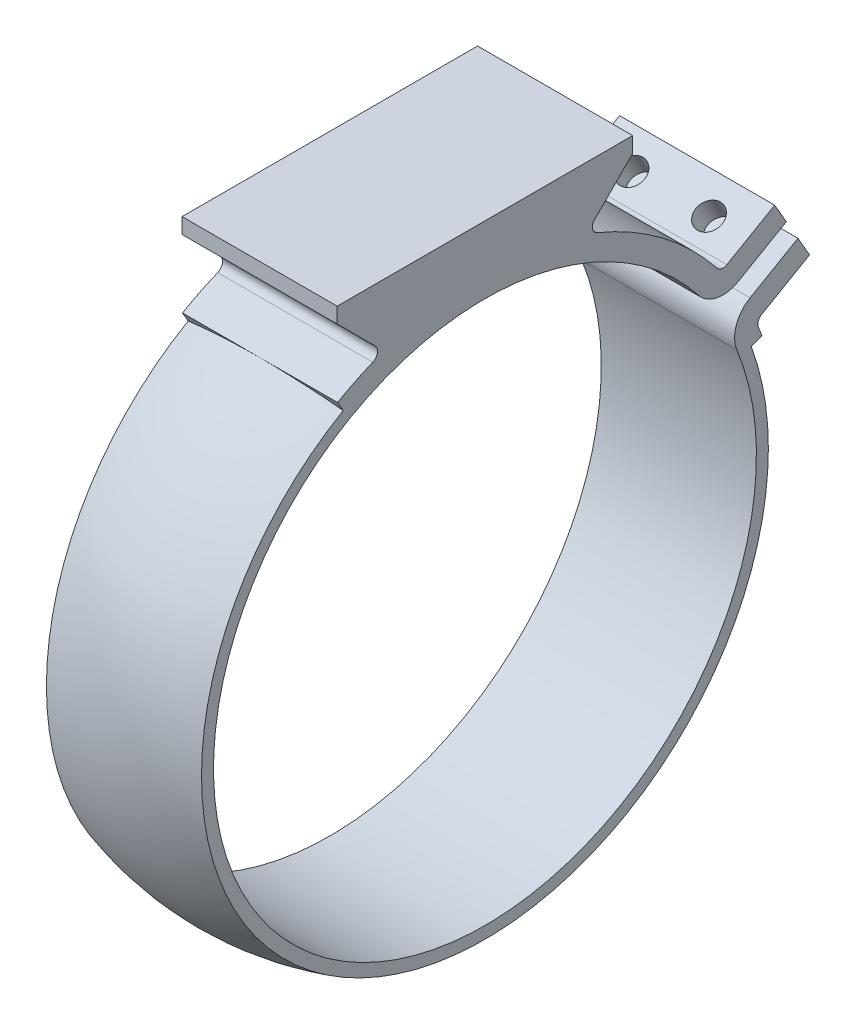
ISO-10303-21;
HEADER;
FILE_DESCRIPTION(('STEP AP214'),'2;1');
FILE_NAME('part.step','',(''),(''),'','','');
FILE_SCHEMA(('AUTOMOTIVE_DESIGN { 1 0 10303 214 1 1 1 1 }'));
ENDSEC;
DATA;
#1=APPLICATION_CONTEXT('core data for automotive mechanical design processes');
#2=APPLICATION_PROTOCOL_DEFINITION('international standard','automotive_design',2000,#1);
#3=PRODUCT_CONTEXT('',#1,'mechanical');
#4=PRODUCT('Part','Part','',(#3));
#5=PRODUCT_RELATED_PRODUCT_CATEGORY('part','',(#4));
#6=PRODUCT_DEFINITION_FORMATION('','',#4);
#7=PRODUCT_DEFINITION_CONTEXT('part definition',#1,'design');
#8=PRODUCT_DEFINITION('design','',#6,#7);
#9=PRODUCT_DEFINITION_SHAPE('','',#8);
#10=(LENGTH_UNIT() NAMED_UNIT(*) SI_UNIT(.MILLI.,.METRE.));
#11=(NAMED_UNIT(*) PLANE_ANGLE_UNIT() SI_UNIT($,.RADIAN.));
#12=(NAMED_UNIT(*) SI_UNIT($,.STERADIAN.) SOLID_ANGLE_UNIT());
#13=UNCERTAINTY_MEASURE_WITH_UNIT(LENGTH_MEASURE(1.E-05),#10,'distance_accuracy_value','');
#14=(GEOMETRIC_REPRESENTATION_CONTEXT(3) GLOBAL_UNCERTAINTY_ASSIGNED_CONTEXT((#13)) GLOBAL_UNIT_ASSIGNED_CONTEXT((#10,
#11,#12)) REPRESENTATION_CONTEXT('',''));
#15=CARTESIAN_POINT('',(0.,0.,0.));
#16=DIRECTION('',(0.,0.,1.));
#17=DIRECTION('',(1.,0.,0.));
#18=AXIS2_PLACEMENT_3D('',#15,#16,#17);
#19=CARTESIAN_POINT('',(20.,0.,0.));
#20=DIRECTION('',(-1.,0.,0.));
#21=DIRECTION('',(0.,0.,1.));
#22=AXIS2_PLACEMENT_3D('',#19,#20,#21);
#23=CYLINDRICAL_SURFACE('',#22,38.0000000000001);
#24=DIRECTION('',(-1.,0.,0.));
#25=VECTOR('',#24,1.);
#26=CARTESIAN_POINT('',(20.,12.9967654463756,-35.7083195898645));
#27=LINE('',#26,#25);
#28=CARTESIAN_POINT('',(0.,12.9967654463756,-35.7083195898645));
#29=VERTEX_POINT('',#28);
#30=CARTESIAN_POINT('',(10.,12.9967654463756,-35.7083195898645));
#31=VERTEX_POINT('',#30);
#32=EDGE_CURVE('E238',#29,#31,#27,.F.);
#33=ORIENTED_EDGE('',*,*,#32,.F.);
#34=CARTESIAN_POINT('',(0.,0.,0.));
#35=DIRECTION('',(1.,0.,0.));
#36=DIRECTION('',(0.,0.,-1.));
#37=AXIS2_PLACEMENT_3D('',#34,#35,#36);
#38=CIRCLE('',#37,38.0000000000001);
#39=CARTESIAN_POINT('',(0.,14.1691049973129,-35.2595584710746));
#40=VERTEX_POINT('',#39);
#41=EDGE_CURVE('E271',#29,#40,#38,.T.);
#42=ORIENTED_EDGE('',*,*,#41,.T.);
#43=DIRECTION('',(-1.,0.,0.));
#44=VECTOR('',#43,1.);
#45=CARTESIAN_POINT('',(20.,14.1691049973129,-35.2595584710746));
#46=LINE('',#45,#44);
#47=CARTESIAN_POINT('',(20.,14.1691049973129,-35.2595584710746));
#48=VERTEX_POINT('',#47);
#49=EDGE_CURVE('E373',#40,#48,#46,.F.);
#50=ORIENTED_EDGE('',*,*,#49,.T.);
#51=CARTESIAN_POINT('',(20.,0.,0.));
#52=DIRECTION('',(1.,0.,0.));
#53=DIRECTION('',(0.,0.,-1.));
#54=AXIS2_PLACEMENT_3D('',#51,#52,#53);
#55=CIRCLE('',#54,38.0000000000001);
#56=CARTESIAN_POINT('',(20.,12.9967654463756,-35.7083195898645));
#57=VERTEX_POINT('',#56);
#58=EDGE_CURVE('E274',#57,#48,#55,.T.);
#59=ORIENTED_EDGE('',*,*,#58,.F.);
#60=EDGE_CURVE('E240',#31,#57,#27,.F.);
#61=ORIENTED_EDGE('',*,*,#60,.F.);
#62=EDGE_LOOP('',(#33,#42,#50,#59,#61));
#63=FACE_BOUND('',#62,.T.);
#64=ADVANCED_FACE('F32',(#63),#23,.T.);
#65=CARTESIAN_POINT('',(20.,0.,0.));
#66=DIRECTION('',(1.,0.,0.));
#67=DIRECTION('',(0.,0.,-1.));
#68=AXIS2_PLACEMENT_3D('',#65,#66,#67);
#69=PLANE('',#68);
#70=CARTESIAN_POINT('',(20.,0.,0.));
#71=DIRECTION('',(1.,0.,0.));
#72=DIRECTION('',(0.,0.,-1.));
#73=AXIS2_PLACEMENT_3D('',#70,#71,#72);
#74=CIRCLE('',#73,36.5410196624969);
#75=CARTESIAN_POINT('',(20.,12.4977647822334,-34.3373265328411));
#76=VERTEX_POINT('',#75);
#77=CARTESIAN_POINT('',(20.,31.6454513079091,18.2705098312483));
#78=VERTEX_POINT('',#77);
#79=EDGE_CURVE('E212',#76,#78,#74,.F.);
#80=ORIENTED_EDGE('',*,*,#79,.F.);
#81=DIRECTION('',(0.,0.342020143325672,-0.939692620785907));
#82=VECTOR('',#81,1.);
#83=CARTESIAN_POINT('',(20.,0.,0.));
#84=LINE('',#83,#82);
#85=EDGE_CURVE('E224',#76,#57,#84,.T.);
#86=ORIENTED_EDGE('',*,*,#85,.T.);
#87=ORIENTED_EDGE('',*,*,#58,.T.);
#88=CARTESIAN_POINT('',(20.,14.5419761814527,-36.1874415887344));
#89=DIRECTION('',(1.,0.,0.));
#90=DIRECTION('',(0.,0.,-1.));
#91=AXIS2_PLACEMENT_3D('',#88,#89,#90);
#92=CIRCLE('',#91,1.);
#93=CARTESIAN_POINT('',(20.,15.4080015852372,-35.6874415887344));
#94=VERTEX_POINT('',#93);
#95=EDGE_CURVE('E391',#48,#94,#92,.F.);
#96=ORIENTED_EDGE('',*,*,#95,.T.);
#97=DIRECTION('',(0.,0.499999999999998,-0.86602540378444));
#98=VECTOR('',#97,1.);
#99=CARTESIAN_POINT('',(20.,18.9691916276951,-41.85560367768));
#100=LINE('',#99,#98);
#101=CARTESIAN_POINT('',(20.,18.9691916276951,-41.85560367768));
#102=VERTEX_POINT('',#101);
#103=EDGE_CURVE('E273',#94,#102,#100,.T.);
#104=ORIENTED_EDGE('',*,*,#103,.T.);
#105=DIRECTION('',(0.,0.866025403784441,0.499999999999997));
#106=VECTOR('',#105,1.);
#107=CARTESIAN_POINT('',(20.,21.5672678390484,-40.35560367768));
#108=LINE('',#107,#106);
#109=CARTESIAN_POINT('',(20.,21.5672678390484,-40.35560367768));
#110=VERTEX_POINT('',#109);
#111=EDGE_CURVE('E276',#102,#110,#108,.T.);
#112=ORIENTED_EDGE('',*,*,#111,.T.);
#113=DIRECTION('',(0.,-0.499999999999998,0.86602540378444));
#114=VECTOR('',#113,1.);
#115=CARTESIAN_POINT('',(20.,16.1848830792284,-31.0330398077872));
#116=LINE('',#115,#114);
#117=CARTESIAN_POINT('',(20.,18.0060777965905,-34.1874415887344));
#118=VERTEX_POINT('',#117);
#119=EDGE_CURVE('E278',#110,#118,#116,.T.);
#120=ORIENTED_EDGE('',*,*,#119,.T.);
#121=CARTESIAN_POINT('',(20.,14.5419761814527,-36.1874415887344));
#122=DIRECTION('',(1.,0.,0.));
#123=DIRECTION('',(0.,0.,-1.));
#124=AXIS2_PLACEMENT_3D('',#121,#122,#123);
#125=CIRCLE('',#124,4.);
#126=CARTESIAN_POINT('',(20.,13.0504914448935,-32.475909118095));
#127=VERTEX_POINT('',#126);
#128=EDGE_CURVE('E418',#118,#127,#125,.T.);
#129=ORIENTED_EDGE('',*,*,#128,.T.);
#130=CARTESIAN_POINT('',(20.,0.,0.));
#131=DIRECTION('',(-1.,0.,0.));
#132=DIRECTION('',(0.,0.,-1.));
#133=AXIS2_PLACEMENT_3D('',#130,#131,#132);
#134=CIRCLE('',#133,35.);
#135=CARTESIAN_POINT('',(20.,21.5997165848169,-27.5400116821977));
#136=VERTEX_POINT('',#135);
#137=EDGE_CURVE('E281',#127,#136,#134,.T.);
#138=ORIENTED_EDGE('',*,*,#137,.T.);
#139=CARTESIAN_POINT('',(20.,24.0682556230817,-30.6874415887346));
#140=DIRECTION('',(1.,0.,0.));
#141=DIRECTION('',(0.,0.,-1.));
#142=AXIS2_PLACEMENT_3D('',#139,#140,#141);
#143=CIRCLE('',#142,4.);
#144=CARTESIAN_POINT('',(20.,20.6041540079439,-32.6874415887346));
#145=VERTEX_POINT('',#144);
#146=EDGE_CURVE('E416',#136,#145,#143,.T.);
#147=ORIENTED_EDGE('',*,*,#146,.T.);
#148=DIRECTION('',(0.,0.499999999999998,-0.86602540378444));
#149=VECTOR('',#148,1.);
#150=CARTESIAN_POINT('',(20.,18.7829592905818,-29.5330398077873));
#151=LINE('',#150,#149);
#152=CARTESIAN_POINT('',(20.,24.1653440504018,-38.85560367768));
#153=VERTEX_POINT('',#152);
#154=EDGE_CURVE('E284',#145,#153,#151,.T.);
#155=ORIENTED_EDGE('',*,*,#154,.T.);
#156=DIRECTION('',(0.,0.866025403784441,0.499999999999997));
#157=VECTOR('',#156,1.);
#158=CARTESIAN_POINT('',(20.,24.1653440504018,-38.85560367768));
#159=LINE('',#158,#157);
#160=CARTESIAN_POINT('',(20.,26.7634202617551,-37.35560367768));
#161=VERTEX_POINT('',#160);
#162=EDGE_CURVE('E286',#153,#161,#159,.T.);
#163=ORIENTED_EDGE('',*,*,#162,.T.);
#164=DIRECTION('',(0.,-0.499999999999997,0.86602540378444));
#165=VECTOR('',#164,1.);
#166=CARTESIAN_POINT('',(20.,26.7634202617551,-37.35560367768));
#167=LINE('',#166,#165);
#168=CARTESIAN_POINT('',(20.,23.2022302192972,-31.1874415887346));
#169=VERTEX_POINT('',#168);
#170=EDGE_CURVE('E288',#161,#169,#167,.T.);
#171=ORIENTED_EDGE('',*,*,#170,.T.);
#172=CARTESIAN_POINT('',(20.,24.0682556230816,-30.6874415887346));
#173=DIRECTION('',(1.,0.,0.));
#174=DIRECTION('',(0.,0.,-1.));
#175=AXIS2_PLACEMENT_3D('',#172,#173,#174);
#176=CIRCLE('',#175,1.);
#177=CARTESIAN_POINT('',(20.,23.4511208635154,-29.9005841121003));
#178=VERTEX_POINT('',#177);
#179=EDGE_CURVE('E395',#169,#178,#176,.F.);
#180=ORIENTED_EDGE('',*,*,#179,.T.);
#181=CARTESIAN_POINT('',(20.,0.,0.));
#182=DIRECTION('',(1.,0.,0.));
#183=DIRECTION('',(0.,0.,-1.));
#184=AXIS2_PLACEMENT_3D('',#181,#182,#183);
#185=CIRCLE('',#184,38.);
#186=CARTESIAN_POINT('',(20.,35.1410300021787,-14.4605674295988));
#187=VERTEX_POINT('',#186);
#188=EDGE_CURVE('E291',#178,#187,#185,.T.);
#189=ORIENTED_EDGE('',*,*,#188,.T.);
#190=CARTESIAN_POINT('',(20.,36.0657939496044,-14.8411086777461));
#191=DIRECTION('',(1.,0.,0.));
#192=DIRECTION('',(0.,0.,-1.));
#193=AXIS2_PLACEMENT_3D('',#190,#191,#192);
#194=CIRCLE('',#193,1.);
#195=CARTESIAN_POINT('',(20.,36.772900730791,-14.1340018965596));
#196=VERTEX_POINT('',#195);
#197=EDGE_CURVE('E403',#187,#196,#194,.F.);
#198=ORIENTED_EDGE('',*,*,#197,.T.);
#199=DIRECTION('',(0.,0.707106781186544,-0.707106781186551));
#200=VECTOR('',#199,1.);
#201=CARTESIAN_POINT('',(20.,41.6888988342313,-19.05));
#202=LINE('',#201,#200);
#203=CARTESIAN_POINT('',(20.,41.6888988342313,-19.05));
#204=VERTEX_POINT('',#203);
#205=EDGE_CURVE('E294',#196,#204,#202,.T.);
#206=ORIENTED_EDGE('',*,*,#205,.T.);
#207=DIRECTION('',(0.,1.,0.));
#208=VECTOR('',#207,1.);
#209=CARTESIAN_POINT('',(20.,43.6888988342313,-19.05));
#210=LINE('',#209,#208);
#211=CARTESIAN_POINT('',(20.,43.6888988342313,-19.05));
#212=VERTEX_POINT('',#211);
#213=EDGE_CURVE('E296',#204,#212,#210,.T.);
#214=ORIENTED_EDGE('',*,*,#213,.T.);
#215=DIRECTION('',(0.,0.,1.));
#216=VECTOR('',#215,1.);
#217=CARTESIAN_POINT('',(20.,43.6888988342313,19.05));
#218=LINE('',#217,#216);
#219=CARTESIAN_POINT('',(20.,43.6888988342313,19.05));
#220=VERTEX_POINT('',#219);
#221=EDGE_CURVE('E298',#212,#220,#218,.T.);
#222=ORIENTED_EDGE('',*,*,#221,.T.);
#223=DIRECTION('',(0.,-1.,0.));
#224=VECTOR('',#223,1.);
#225=CARTESIAN_POINT('',(20.,41.6888988342313,19.05));
#226=LINE('',#225,#224);
#227=CARTESIAN_POINT('',(20.,41.6888988342313,19.05));
#228=VERTEX_POINT('',#227);
#229=EDGE_CURVE('E300',#220,#228,#226,.T.);
#230=ORIENTED_EDGE('',*,*,#229,.T.);
#231=DIRECTION('',(0.,-0.707106781186549,-0.707106781186546));
#232=VECTOR('',#231,1.);
#233=CARTESIAN_POINT('',(20.,35.6888988342313,13.05));
#234=LINE('',#233,#232);
#235=CARTESIAN_POINT('',(20.,36.7729007307911,14.1340018965597));
#236=VERTEX_POINT('',#235);
#237=EDGE_CURVE('E302',#228,#236,#234,.T.);
#238=ORIENTED_EDGE('',*,*,#237,.T.);
#239=CARTESIAN_POINT('',(20.,36.0657939496045,14.8411086777463));
#240=DIRECTION('',(1.,0.,0.));
#241=DIRECTION('',(0.,0.,-1.));
#242=AXIS2_PLACEMENT_3D('',#239,#240,#241);
#243=CIRCLE('',#242,1.);
#244=CARTESIAN_POINT('',(20.,35.1410300021787,14.4605674295989));
#245=VERTEX_POINT('',#244);
#246=EDGE_CURVE('E399',#236,#245,#243,.F.);
#247=ORIENTED_EDGE('',*,*,#246,.T.);
#248=CARTESIAN_POINT('',(20.,32.9089653438088,18.9999999999998));
#249=VERTEX_POINT('',#248);
#250=EDGE_CURVE('E237',#245,#249,#55,.T.);
#251=ORIENTED_EDGE('',*,*,#250,.T.);
#252=DIRECTION('',(0.,0.866025403784442,0.499999999999995));
#253=VECTOR('',#252,1.);
#254=CARTESIAN_POINT('',(20.,0.,0.));
#255=LINE('',#254,#253);
#256=EDGE_CURVE('E228',#78,#249,#255,.T.);
#257=ORIENTED_EDGE('',*,*,#256,.F.);
#258=EDGE_LOOP('',(#80,#86,#87,#96,#104,#112,#120,#129,#138,#147,#155,#163,#171,#180,#189,#198,
#206,#214,#222,#230,#238,#247,#251,#257));
#259=FACE_BOUND('',#258,.T.);
#260=ADVANCED_FACE('F235',(#259),#69,.T.);
#261=CARTESIAN_POINT('',(0.,0.,0.));
#262=DIRECTION('',(1.,0.,0.));
#263=DIRECTION('',(0.,0.,-1.));
#264=AXIS2_PLACEMENT_3D('',#261,#262,#263);
#265=PLANE('',#264);
#266=DIRECTION('',(0.,0.342020143325672,-0.939692620785907));
#267=VECTOR('',#266,1.);
#268=CARTESIAN_POINT('',(0.,0.,0.));
#269=LINE('',#268,#267);
#270=CARTESIAN_POINT('',(0.,12.4977647822334,-34.3373265328411));
#271=VERTEX_POINT('',#270);
#272=EDGE_CURVE('E11',#271,#29,#269,.T.);
#273=ORIENTED_EDGE('',*,*,#272,.F.);
#274=CARTESIAN_POINT('',(0.,0.,0.));
#275=DIRECTION('',(1.,0.,0.));
#276=DIRECTION('',(0.,0.,-1.));
#277=AXIS2_PLACEMENT_3D('',#274,#275,#276);
#278=CIRCLE('',#277,36.5410196624969);
#279=CARTESIAN_POINT('',(0.,31.6454513079091,18.2705098312483));
#280=VERTEX_POINT('',#279);
#281=EDGE_CURVE('E40',#271,#280,#278,.F.);
#282=ORIENTED_EDGE('',*,*,#281,.T.);
#283=DIRECTION('',(0.,0.866025403784442,0.499999999999995));
#284=VECTOR('',#283,1.);
#285=CARTESIAN_POINT('',(0.,0.,0.));
#286=LINE('',#285,#284);
#287=CARTESIAN_POINT('',(0.,32.9089653438088,18.9999999999998));
#288=VERTEX_POINT('',#287);
#289=EDGE_CURVE('E423',#280,#288,#286,.T.);
#290=ORIENTED_EDGE('',*,*,#289,.T.);
#291=CARTESIAN_POINT('',(0.,35.1410300021787,14.4605674295989));
#292=VERTEX_POINT('',#291);
#293=EDGE_CURVE('E306',#292,#288,#38,.T.);
#294=ORIENTED_EDGE('',*,*,#293,.F.);
#295=CARTESIAN_POINT('',(0.,36.0657939496045,14.8411086777463));
#296=DIRECTION('',(1.,0.,0.));
#297=DIRECTION('',(0.,0.,-1.));
#298=AXIS2_PLACEMENT_3D('',#295,#296,#297);
#299=CIRCLE('',#298,1.);
#300=CARTESIAN_POINT('',(0.,36.7729007307911,14.1340018965597));
#301=VERTEX_POINT('',#300);
#302=EDGE_CURVE('E397',#292,#301,#299,.T.);
#303=ORIENTED_EDGE('',*,*,#302,.T.);
#304=DIRECTION('',(0.,-0.707106781186549,-0.707106781186546));
#305=VECTOR('',#304,1.);
#306=CARTESIAN_POINT('',(0.,35.6888988342313,13.05));
#307=LINE('',#306,#305);
#308=CARTESIAN_POINT('',(0.,41.6888988342313,19.05));
#309=VERTEX_POINT('',#308);
#310=EDGE_CURVE('E337',#309,#301,#307,.T.);
#311=ORIENTED_EDGE('',*,*,#310,.F.);
#312=DIRECTION('',(0.,-1.,0.));
#313=VECTOR('',#312,1.);
#314=CARTESIAN_POINT('',(0.,41.6888988342313,19.05));
#315=LINE('',#314,#313);
#316=CARTESIAN_POINT('',(0.,43.6888988342313,19.05));
#317=VERTEX_POINT('',#316);
#318=EDGE_CURVE('E335',#317,#309,#315,.T.);
#319=ORIENTED_EDGE('',*,*,#318,.F.);
#320=DIRECTION('',(0.,0.,1.));
#321=VECTOR('',#320,1.);
#322=CARTESIAN_POINT('',(0.,43.6888988342313,19.05));
#323=LINE('',#322,#321);
#324=CARTESIAN_POINT('',(0.,43.6888988342313,-19.05));
#325=VERTEX_POINT('',#324);
#326=EDGE_CURVE('E333',#325,#317,#323,.T.);
#327=ORIENTED_EDGE('',*,*,#326,.F.);
#328=DIRECTION('',(0.,1.,0.));
#329=VECTOR('',#328,1.);
#330=CARTESIAN_POINT('',(0.,43.6888988342313,-19.05));
#331=LINE('',#330,#329);
#332=CARTESIAN_POINT('',(0.,41.6888988342313,-19.05));
#333=VERTEX_POINT('',#332);
#334=EDGE_CURVE('E331',#333,#325,#331,.T.);
#335=ORIENTED_EDGE('',*,*,#334,.F.);
#336=DIRECTION('',(0.,0.707106781186544,-0.707106781186551));
#337=VECTOR('',#336,1.);
#338=CARTESIAN_POINT('',(0.,41.6888988342313,-19.05));
#339=LINE('',#338,#337);
#340=CARTESIAN_POINT('',(0.,36.772900730791,-14.1340018965596));
#341=VERTEX_POINT('',#340);
#342=EDGE_CURVE('E329',#341,#333,#339,.T.);
#343=ORIENTED_EDGE('',*,*,#342,.F.);
#344=CARTESIAN_POINT('',(0.,36.0657939496044,-14.8411086777461));
#345=DIRECTION('',(1.,0.,0.));
#346=DIRECTION('',(0.,0.,-1.));
#347=AXIS2_PLACEMENT_3D('',#344,#345,#346);
#348=CIRCLE('',#347,1.);
#349=CARTESIAN_POINT('',(0.,35.1410300021787,-14.4605674295988));
#350=VERTEX_POINT('',#349);
#351=EDGE_CURVE('E401',#341,#350,#348,.T.);
#352=ORIENTED_EDGE('',*,*,#351,.T.);
#353=CARTESIAN_POINT('',(0.,0.,0.));
#354=DIRECTION('',(1.,0.,0.));
#355=DIRECTION('',(0.,0.,-1.));
#356=AXIS2_PLACEMENT_3D('',#353,#354,#355);
#357=CIRCLE('',#356,38.);
#358=CARTESIAN_POINT('',(0.,23.4511208635154,-29.9005841121003));
#359=VERTEX_POINT('',#358);
#360=EDGE_CURVE('E326',#359,#350,#357,.T.);
#361=ORIENTED_EDGE('',*,*,#360,.F.);
#362=CARTESIAN_POINT('',(0.,24.0682556230816,-30.6874415887346));
#363=DIRECTION('',(1.,0.,0.));
#364=DIRECTION('',(0.,0.,-1.));
#365=AXIS2_PLACEMENT_3D('',#362,#363,#364);
#366=CIRCLE('',#365,1.);
#367=CARTESIAN_POINT('',(0.,23.2022302192972,-31.1874415887346));
#368=VERTEX_POINT('',#367);
#369=EDGE_CURVE('E393',#359,#368,#366,.T.);
#370=ORIENTED_EDGE('',*,*,#369,.T.);
#371=DIRECTION('',(0.,-0.499999999999997,0.86602540378444));
#372=VECTOR('',#371,1.);
#373=CARTESIAN_POINT('',(0.,26.7634202617551,-37.35560367768));
#374=LINE('',#373,#372);
#375=CARTESIAN_POINT('',(0.,26.7634202617551,-37.35560367768));
#376=VERTEX_POINT('',#375);
#377=EDGE_CURVE('E323',#376,#368,#374,.T.);
#378=ORIENTED_EDGE('',*,*,#377,.F.);
#379=DIRECTION('',(0.,0.866025403784441,0.499999999999997));
#380=VECTOR('',#379,1.);
#381=CARTESIAN_POINT('',(0.,24.1653440504018,-38.85560367768));
#382=LINE('',#381,#380);
#383=CARTESIAN_POINT('',(0.,24.1653440504018,-38.85560367768));
#384=VERTEX_POINT('',#383);
#385=EDGE_CURVE('E321',#384,#376,#382,.T.);
#386=ORIENTED_EDGE('',*,*,#385,.F.);
#387=DIRECTION('',(0.,0.499999999999998,-0.86602540378444));
#388=VECTOR('',#387,1.);
#389=CARTESIAN_POINT('',(0.,18.7829592905818,-29.5330398077873));
#390=LINE('',#389,#388);
#391=CARTESIAN_POINT('',(0.,20.6041540079439,-32.6874415887346));
#392=VERTEX_POINT('',#391);
#393=EDGE_CURVE('E319',#392,#384,#390,.T.);
#394=ORIENTED_EDGE('',*,*,#393,.F.);
#395=CARTESIAN_POINT('',(0.,24.0682556230817,-30.6874415887346));
#396=DIRECTION('',(1.,0.,0.));
#397=DIRECTION('',(0.,0.,-1.));
#398=AXIS2_PLACEMENT_3D('',#395,#396,#397);
#399=CIRCLE('',#398,4.);
#400=CARTESIAN_POINT('',(0.,21.5997165848169,-27.5400116821977));
#401=VERTEX_POINT('',#400);
#402=EDGE_CURVE('E410',#392,#401,#399,.F.);
#403=ORIENTED_EDGE('',*,*,#402,.T.);
#404=CARTESIAN_POINT('',(0.,0.,0.));
#405=DIRECTION('',(-1.,0.,0.));
#406=DIRECTION('',(0.,0.,-1.));
#407=AXIS2_PLACEMENT_3D('',#404,#405,#406);
#408=CIRCLE('',#407,35.);
#409=CARTESIAN_POINT('',(0.,13.0504914448935,-32.475909118095));
#410=VERTEX_POINT('',#409);
#411=EDGE_CURVE('E316',#410,#401,#408,.T.);
#412=ORIENTED_EDGE('',*,*,#411,.F.);
#413=CARTESIAN_POINT('',(0.,14.5419761814527,-36.1874415887344));
#414=DIRECTION('',(1.,0.,0.));
#415=DIRECTION('',(0.,0.,-1.));
#416=AXIS2_PLACEMENT_3D('',#413,#414,#415);
#417=CIRCLE('',#416,4.);
#418=CARTESIAN_POINT('',(0.,18.0060777965905,-34.1874415887344));
#419=VERTEX_POINT('',#418);
#420=EDGE_CURVE('E412',#410,#419,#417,.F.);
#421=ORIENTED_EDGE('',*,*,#420,.T.);
#422=DIRECTION('',(0.,-0.499999999999998,0.86602540378444));
#423=VECTOR('',#422,1.);
#424=CARTESIAN_POINT('',(0.,16.1848830792284,-31.0330398077872));
#425=LINE('',#424,#423);
#426=CARTESIAN_POINT('',(0.,21.5672678390484,-40.35560367768));
#427=VERTEX_POINT('',#426);
#428=EDGE_CURVE('E313',#427,#419,#425,.T.);
#429=ORIENTED_EDGE('',*,*,#428,.F.);
#430=DIRECTION('',(0.,0.866025403784441,0.499999999999997));
#431=VECTOR('',#430,1.);
#432=CARTESIAN_POINT('',(0.,21.5672678390484,-40.35560367768));
#433=LINE('',#432,#431);
#434=CARTESIAN_POINT('',(0.,18.9691916276951,-41.85560367768));
#435=VERTEX_POINT('',#434);
#436=EDGE_CURVE('E311',#435,#427,#433,.T.);
#437=ORIENTED_EDGE('',*,*,#436,.F.);
#438=DIRECTION('',(0.,0.499999999999998,-0.86602540378444));
#439=VECTOR('',#438,1.);
#440=CARTESIAN_POINT('',(0.,18.9691916276951,-41.85560367768));
#441=LINE('',#440,#439);
#442=CARTESIAN_POINT('',(0.,15.4080015852372,-35.6874415887344));
#443=VERTEX_POINT('',#442);
#444=EDGE_CURVE('E309',#443,#435,#441,.T.);
#445=ORIENTED_EDGE('',*,*,#444,.F.);
#446=CARTESIAN_POINT('',(0.,14.5419761814527,-36.1874415887344));
#447=DIRECTION('',(1.,0.,0.));
#448=DIRECTION('',(0.,0.,-1.));
#449=AXIS2_PLACEMENT_3D('',#446,#447,#448);
#450=CIRCLE('',#449,1.);
#451=EDGE_CURVE('E388',#443,#40,#450,.T.);
#452=ORIENTED_EDGE('',*,*,#451,.T.);
#453=ORIENTED_EDGE('',*,*,#41,.F.);
#454=EDGE_LOOP('',(#273,#282,#290,#294,#303,#311,#319,#327,#335,#343,#352,#361,#370,#378,#386,
#394,#403,#412,#421,#429,#437,#445,#452,#453));
#455=FACE_BOUND('',#454,.T.);
#456=ADVANCED_FACE('F431',(#455),#265,.F.);
#457=ORIENTED_EDGE('',*,*,#293,.T.);
#458=DIRECTION('',(-1.,0.,0.));
#459=VECTOR('',#458,1.);
#460=CARTESIAN_POINT('',(20.,32.9089653438088,18.9999999999998));
#461=LINE('',#460,#459);
#462=CARTESIAN_POINT('',(10.,32.9089653438088,18.9999999999998));
#463=VERTEX_POINT('',#462);
#464=EDGE_CURVE('E47',#288,#463,#461,.F.);
#465=ORIENTED_EDGE('',*,*,#464,.T.);
#466=EDGE_CURVE('E230',#463,#249,#461,.F.);
#467=ORIENTED_EDGE('',*,*,#466,.T.);
#468=ORIENTED_EDGE('',*,*,#250,.F.);
#469=DIRECTION('',(-1.,0.,0.));
#470=VECTOR('',#469,1.);
#471=CARTESIAN_POINT('',(20.,35.1410300021787,14.4605674295989));
#472=LINE('',#471,#470);
#473=EDGE_CURVE('E367',#245,#292,#472,.T.);
#474=ORIENTED_EDGE('',*,*,#473,.T.);
#475=EDGE_LOOP('',(#457,#465,#467,#468,#474));
#476=FACE_BOUND('',#475,.T.);
#477=ADVANCED_FACE('F441',(#476),#23,.T.);
#478=CARTESIAN_POINT('',(20.,18.9691916276951,-41.85560367768));
#479=DIRECTION('',(0.,0.86602540378444,0.499999999999998));
#480=DIRECTION('',(0.,-0.499999999999998,0.86602540378444));
#481=AXIS2_PLACEMENT_3D('',#478,#479,#480);
#482=PLANE('',#481);
#483=DIRECTION('',(1.,0.,0.));
#484=VECTOR('',#483,1.);
#485=CARTESIAN_POINT('',(0.,15.4080015852372,-35.6874415887344));
#486=LINE('',#485,#484);
#487=CARTESIAN_POINT('',(15.4162242248121,15.4080015852372,-35.6874415887344));
#488=VERTEX_POINT('',#487);
#489=EDGE_CURVE('E364',#94,#488,#486,.F.);
#490=ORIENTED_EDGE('',*,*,#489,.T.);
#491=CARTESIAN_POINT('',(15.,16.9691916276951,-38.3915020625422));
#492=DIRECTION('',(0.,-0.86602540378444,-0.499999999999998));
#493=DIRECTION('',(0.,0.499999999999998,-0.86602540378444));
#494=AXIS2_PLACEMENT_3D('',#491,#492,#493);
#495=CIRCLE('',#494,3.15);
#496=CARTESIAN_POINT('',(14.5837757751879,15.4080015852372,-35.6874415887344));
#497=VERTEX_POINT('',#496);
#498=EDGE_CURVE('E223',#497,#488,#495,.T.);
#499=ORIENTED_EDGE('',*,*,#498,.F.);
#500=CARTESIAN_POINT('',(5.41622422481207,15.4080015852372,-35.6874415887344));
#501=VERTEX_POINT('',#500);
#502=EDGE_CURVE('E369',#497,#501,#486,.F.);
#503=ORIENTED_EDGE('',*,*,#502,.T.);
#504=CARTESIAN_POINT('',(5.,16.9691916276951,-38.3915020625422));
#505=DIRECTION('',(0.,-0.86602540378444,-0.499999999999998));
#506=DIRECTION('',(0.,0.499999999999998,-0.86602540378444));
#507=AXIS2_PLACEMENT_3D('',#504,#505,#506);
#508=CIRCLE('',#507,3.15);
#509=CARTESIAN_POINT('',(4.58377577518786,15.4080015852372,-35.6874415887344));
#510=VERTEX_POINT('',#509);
#511=EDGE_CURVE('E257',#510,#501,#508,.T.);
#512=ORIENTED_EDGE('',*,*,#511,.F.);
#513=EDGE_CURVE('E363',#510,#443,#486,.F.);
#514=ORIENTED_EDGE('',*,*,#513,.T.);
#515=ORIENTED_EDGE('',*,*,#444,.T.);
#516=DIRECTION('',(-1.,0.,0.));
#517=VECTOR('',#516,1.);
#518=CARTESIAN_POINT('',(20.,18.9691916276951,-41.85560367768));
#519=LINE('',#518,#517);
#520=EDGE_CURVE('E360',#102,#435,#519,.T.);
#521=ORIENTED_EDGE('',*,*,#520,.F.);
#522=ORIENTED_EDGE('',*,*,#103,.F.);
#523=EDGE_LOOP('',(#490,#499,#503,#512,#514,#515,#521,#522));
#524=FACE_BOUND('',#523,.T.);
#525=ADVANCED_FACE('F526',(#524),#482,.F.);
#526=CARTESIAN_POINT('',(20.,21.5672678390484,-40.35560367768));
#527=DIRECTION('',(0.,-0.499999999999997,0.866025403784441));
#528=DIRECTION('',(0.,-0.866025403784441,-0.499999999999997));
#529=AXIS2_PLACEMENT_3D('',#526,#527,#528);
#530=PLANE('',#529);
#531=ORIENTED_EDGE('',*,*,#436,.T.);
#532=DIRECTION('',(-1.,0.,0.));
#533=VECTOR('',#532,1.);
#534=CARTESIAN_POINT('',(20.,21.5672678390484,-40.35560367768));
#535=LINE('',#534,#533);
#536=EDGE_CURVE('E357',#110,#427,#535,.T.);
#537=ORIENTED_EDGE('',*,*,#536,.F.);
#538=ORIENTED_EDGE('',*,*,#111,.F.);
#539=ORIENTED_EDGE('',*,*,#520,.T.);
#540=EDGE_LOOP('',(#531,#537,#538,#539));
#541=FACE_BOUND('',#540,.T.);
#542=ADVANCED_FACE('F520',(#541),#530,.F.);
#543=CARTESIAN_POINT('',(20.,16.1848830792284,-31.0330398077872));
#544=DIRECTION('',(0.,-0.86602540378444,-0.499999999999998));
#545=DIRECTION('',(0.,0.499999999999998,-0.86602540378444));
#546=AXIS2_PLACEMENT_3D('',#543,#544,#545);
#547=PLANE('',#546);
#548=CARTESIAN_POINT('',(15.,19.5672678390484,-36.8915020625422));
#549=DIRECTION('',(0.,-0.86602540378444,-0.499999999999998));
#550=DIRECTION('',(0.,0.499999999999998,-0.86602540378444));
#551=AXIS2_PLACEMENT_3D('',#548,#549,#550);
#552=CIRCLE('',#551,1.69999999999999);
#553=CARTESIAN_POINT('',(15.,20.4172678390484,-38.3637452489758));
#554=VERTEX_POINT('',#553);
#555=EDGE_CURVE('E254',#554,#554,#552,.T.);
#556=ORIENTED_EDGE('',*,*,#555,.T.);
#557=EDGE_LOOP('',(#556));
#558=FACE_BOUND('',#557,.T.);
#559=CARTESIAN_POINT('',(5.,19.5672678390484,-36.8915020625422));
#560=DIRECTION('',(0.,-0.86602540378444,-0.499999999999998));
#561=DIRECTION('',(0.,0.499999999999998,-0.86602540378444));
#562=AXIS2_PLACEMENT_3D('',#559,#560,#561);
#563=CIRCLE('',#562,1.69999999999999);
#564=CARTESIAN_POINT('',(5.,20.4172678390484,-38.3637452489758));
#565=VERTEX_POINT('',#564);
#566=EDGE_CURVE('E268',#565,#565,#563,.T.);
#567=ORIENTED_EDGE('',*,*,#566,.T.);
#568=EDGE_LOOP('',(#567));
#569=FACE_BOUND('',#568,.T.);
#570=ORIENTED_EDGE('',*,*,#428,.T.);
#571=DIRECTION('',(-1.,0.,0.));
#572=VECTOR('',#571,1.);
#573=CARTESIAN_POINT('',(20.,18.0060777965905,-34.1874415887344));
#574=LINE('',#573,#572);
#575=EDGE_CURVE('E414',#419,#118,#574,.F.);
#576=ORIENTED_EDGE('',*,*,#575,.T.);
#577=ORIENTED_EDGE('',*,*,#119,.F.);
#578=ORIENTED_EDGE('',*,*,#536,.T.);
#579=EDGE_LOOP('',(#570,#576,#577,#578));
#580=FACE_BOUND('',#579,.T.);
#581=ADVANCED_FACE('F516',(#558,#569,#580),#547,.F.);
#582=CARTESIAN_POINT('',(20.,0.,0.));
#583=DIRECTION('',(-1.,0.,0.));
#584=DIRECTION('',(0.,0.,1.));
#585=AXIS2_PLACEMENT_3D('',#582,#583,#584);
#586=CYLINDRICAL_SURFACE('',#585,35.);
#587=ORIENTED_EDGE('',*,*,#137,.F.);
#588=DIRECTION('',(-1.,0.,0.));
#589=VECTOR('',#588,1.);
#590=CARTESIAN_POINT('',(20.,13.0504914448935,-32.475909118095));
#591=LINE('',#590,#589);
#592=EDGE_CURVE('E407',#127,#410,#591,.T.);
#593=ORIENTED_EDGE('',*,*,#592,.T.);
#594=ORIENTED_EDGE('',*,*,#411,.T.);
#595=DIRECTION('',(-1.,0.,0.));
#596=VECTOR('',#595,1.);
#597=CARTESIAN_POINT('',(20.,21.5997165848169,-27.5400116821977));
#598=LINE('',#597,#596);
#599=EDGE_CURVE('E405',#401,#136,#598,.F.);
#600=ORIENTED_EDGE('',*,*,#599,.T.);
#601=EDGE_LOOP('',(#587,#593,#594,#600));
#602=FACE_BOUND('',#601,.T.);
#603=ADVANCED_FACE('F506',(#602),#586,.F.);
#604=CARTESIAN_POINT('',(20.,18.7829592905818,-29.5330398077873));
#605=DIRECTION('',(0.,0.86602540378444,0.499999999999998));
#606=DIRECTION('',(0.,-0.499999999999998,0.86602540378444));
#607=AXIS2_PLACEMENT_3D('',#604,#605,#606);
#608=PLANE('',#607);
#609=CARTESIAN_POINT('',(15.,22.1653440504018,-35.3915020625422));
#610=DIRECTION('',(0.,0.86602540378444,0.499999999999998));
#611=DIRECTION('',(0.,-0.499999999999998,0.86602540378444));
#612=AXIS2_PLACEMENT_3D('',#609,#610,#611);
#613=CIRCLE('',#612,1.69999999999999);
#614=CARTESIAN_POINT('',(15.,21.3153440504018,-33.9192588761087));
#615=VERTEX_POINT('',#614);
#616=EDGE_CURVE('E251',#615,#615,#613,.T.);
#617=ORIENTED_EDGE('',*,*,#616,.T.);
#618=EDGE_LOOP('',(#617));
#619=FACE_BOUND('',#618,.T.);
#620=CARTESIAN_POINT('',(5.,22.1653440504018,-35.3915020625422));
#621=DIRECTION('',(0.,0.86602540378444,0.499999999999998));
#622=DIRECTION('',(0.,-0.499999999999998,0.86602540378444));
#623=AXIS2_PLACEMENT_3D('',#620,#621,#622);
#624=CIRCLE('',#623,1.69999999999999);
#625=CARTESIAN_POINT('',(5.,21.3153440504018,-33.9192588761087));
#626=VERTEX_POINT('',#625);
#627=EDGE_CURVE('E265',#626,#626,#624,.T.);
#628=ORIENTED_EDGE('',*,*,#627,.T.);
#629=EDGE_LOOP('',(#628));
#630=FACE_BOUND('',#629,.T.);
#631=ORIENTED_EDGE('',*,*,#154,.F.);
#632=DIRECTION('',(-1.,0.,0.));
#633=VECTOR('',#632,1.);
#634=CARTESIAN_POINT('',(20.,20.6041540079439,-32.6874415887346));
#635=LINE('',#634,#633);
#636=EDGE_CURVE('E420',#145,#392,#635,.T.);
#637=ORIENTED_EDGE('',*,*,#636,.T.);
#638=ORIENTED_EDGE('',*,*,#393,.T.);
#639=DIRECTION('',(-1.,0.,0.));
#640=VECTOR('',#639,1.);
#641=CARTESIAN_POINT('',(20.,24.1653440504018,-38.85560367768));
#642=LINE('',#641,#640);
#643=EDGE_CURVE('E354',#153,#384,#642,.T.);
#644=ORIENTED_EDGE('',*,*,#643,.F.);
#645=EDGE_LOOP('',(#631,#637,#638,#644));
#646=FACE_BOUND('',#645,.T.);
#647=ADVANCED_FACE('F499',(#619,#630,#646),#608,.F.);
#648=CARTESIAN_POINT('',(20.,24.1653440504018,-38.85560367768));
#649=DIRECTION('',(0.,-0.499999999999997,0.866025403784441));
#650=DIRECTION('',(0.,-0.866025403784441,-0.499999999999997));
#651=AXIS2_PLACEMENT_3D('',#648,#649,#650);
#652=PLANE('',#651);
#653=ORIENTED_EDGE('',*,*,#385,.T.);
#654=DIRECTION('',(-1.,0.,0.));
#655=VECTOR('',#654,1.);
#656=CARTESIAN_POINT('',(20.,26.7634202617551,-37.35560367768));
#657=LINE('',#656,#655);
#658=EDGE_CURVE('E351',#161,#376,#657,.T.);
#659=ORIENTED_EDGE('',*,*,#658,.F.);
#660=ORIENTED_EDGE('',*,*,#162,.F.);
#661=ORIENTED_EDGE('',*,*,#643,.T.);
#662=EDGE_LOOP('',(#653,#659,#660,#661));
#663=FACE_BOUND('',#662,.T.);
#664=ADVANCED_FACE('F493',(#663),#652,.F.);
#665=CARTESIAN_POINT('',(20.,26.7634202617551,-37.35560367768));
#666=DIRECTION('',(0.,-0.86602540378444,-0.499999999999997));
#667=DIRECTION('',(0.,0.499999999999997,-0.86602540378444));
#668=AXIS2_PLACEMENT_3D('',#665,#666,#667);
#669=PLANE('',#668);
#670=CARTESIAN_POINT('',(15.,24.7634202617551,-33.8915020625422));
#671=DIRECTION('',(0.,-0.86602540378444,-0.499999999999997));
#672=DIRECTION('',(0.,0.499999999999997,-0.86602540378444));
#673=AXIS2_PLACEMENT_3D('',#670,#671,#672);
#674=CIRCLE('',#673,1.69999999999999);
#675=CARTESIAN_POINT('',(15.,25.6134202617551,-35.3637452489758));
#676=VERTEX_POINT('',#675);
#677=EDGE_CURVE('E250',#676,#676,#674,.T.);
#678=ORIENTED_EDGE('',*,*,#677,.T.);
#679=EDGE_LOOP('',(#678));
#680=FACE_BOUND('',#679,.T.);
#681=CARTESIAN_POINT('',(5.,24.7634202617551,-33.8915020625422));
#682=DIRECTION('',(0.,-0.86602540378444,-0.499999999999997));
#683=DIRECTION('',(0.,0.499999999999997,-0.86602540378444));
#684=AXIS2_PLACEMENT_3D('',#681,#682,#683);
#685=CIRCLE('',#684,1.69999999999999);
#686=CARTESIAN_POINT('',(5.,25.6134202617551,-35.3637452489758));
#687=VERTEX_POINT('',#686);
#688=EDGE_CURVE('E264',#687,#687,#685,.T.);
#689=ORIENTED_EDGE('',*,*,#688,.T.);
#690=EDGE_LOOP('',(#689));
#691=FACE_BOUND('',#690,.T.);
#692=ORIENTED_EDGE('',*,*,#377,.T.);
#693=DIRECTION('',(1.,0.,0.));
#694=VECTOR('',#693,1.);
#695=CARTESIAN_POINT('',(20.,23.2022302192972,-31.1874415887346));
#696=LINE('',#695,#694);
#697=EDGE_CURVE('E381',#368,#169,#696,.T.);
#698=ORIENTED_EDGE('',*,*,#697,.T.);
#699=ORIENTED_EDGE('',*,*,#170,.F.);
#700=ORIENTED_EDGE('',*,*,#658,.T.);
#701=EDGE_LOOP('',(#692,#698,#699,#700));
#702=FACE_BOUND('',#701,.T.);
#703=ADVANCED_FACE('F488',(#680,#691,#702),#669,.F.);
#704=CARTESIAN_POINT('',(20.,0.,0.));
#705=DIRECTION('',(-1.,0.,0.));
#706=DIRECTION('',(0.,0.,1.));
#707=AXIS2_PLACEMENT_3D('',#704,#705,#706);
#708=CYLINDRICAL_SURFACE('',#707,38.);
#709=ORIENTED_EDGE('',*,*,#188,.F.);
#710=DIRECTION('',(-1.,0.,0.));
#711=VECTOR('',#710,1.);
#712=CARTESIAN_POINT('',(20.,23.4511208635154,-29.9005841121003));
#713=LINE('',#712,#711);
#714=EDGE_CURVE('E378',#178,#359,#713,.T.);
#715=ORIENTED_EDGE('',*,*,#714,.T.);
#716=ORIENTED_EDGE('',*,*,#360,.T.);
#717=DIRECTION('',(-1.,0.,0.));
#718=VECTOR('',#717,1.);
#719=CARTESIAN_POINT('',(20.,35.1410300021787,-14.4605674295988));
#720=LINE('',#719,#718);
#721=EDGE_CURVE('E376',#350,#187,#720,.F.);
#722=ORIENTED_EDGE('',*,*,#721,.T.);
#723=EDGE_LOOP('',(#709,#715,#716,#722));
#724=FACE_BOUND('',#723,.T.);
#725=ADVANCED_FACE('F477',(#724),#708,.T.);
#726=CARTESIAN_POINT('',(20.,41.6888988342313,-19.05));
#727=DIRECTION('',(0.,0.707106781186551,0.707106781186544));
#728=DIRECTION('',(0.,-0.707106781186544,0.707106781186551));
#729=AXIS2_PLACEMENT_3D('',#726,#727,#728);
#730=PLANE('',#729);
#731=ORIENTED_EDGE('',*,*,#205,.F.);
#732=DIRECTION('',(1.,0.,0.));
#733=VECTOR('',#732,1.);
#734=CARTESIAN_POINT('',(0.,36.772900730791,-14.1340018965596));
#735=LINE('',#734,#733);
#736=EDGE_CURVE('E385',#196,#341,#735,.F.);
#737=ORIENTED_EDGE('',*,*,#736,.T.);
#738=ORIENTED_EDGE('',*,*,#342,.T.);
#739=DIRECTION('',(-1.,0.,0.));
#740=VECTOR('',#739,1.);
#741=CARTESIAN_POINT('',(20.,41.6888988342313,-19.05));
#742=LINE('',#741,#740);
#743=EDGE_CURVE('E348',#204,#333,#742,.T.);
#744=ORIENTED_EDGE('',*,*,#743,.F.);
#745=EDGE_LOOP('',(#731,#737,#738,#744));
#746=FACE_BOUND('',#745,.T.);
#747=ADVANCED_FACE('F470',(#746),#730,.F.);
#748=CARTESIAN_POINT('',(20.,43.6888988342313,-19.05));
#749=DIRECTION('',(0.,0.,1.));
#750=DIRECTION('',(1.,0.,0.));
#751=AXIS2_PLACEMENT_3D('',#748,#749,#750);
#752=PLANE('',#751);
#753=ORIENTED_EDGE('',*,*,#334,.T.);
#754=DIRECTION('',(-1.,0.,0.));
#755=VECTOR('',#754,1.);
#756=CARTESIAN_POINT('',(20.,43.6888988342313,-19.05));
#757=LINE('',#756,#755);
#758=EDGE_CURVE('E345',#212,#325,#757,.T.);
#759=ORIENTED_EDGE('',*,*,#758,.F.);
#760=ORIENTED_EDGE('',*,*,#213,.F.);
#761=ORIENTED_EDGE('',*,*,#743,.T.);
#762=EDGE_LOOP('',(#753,#759,#760,#761));
#763=FACE_BOUND('',#762,.T.);
#764=ADVANCED_FACE('F466',(#763),#752,.F.);
#765=CARTESIAN_POINT('',(20.,43.6888988342313,19.05));
#766=DIRECTION('',(0.,-1.,0.));
#767=DIRECTION('',(0.,0.,-1.));
#768=AXIS2_PLACEMENT_3D('',#765,#766,#767);
#769=PLANE('',#768);
#770=ORIENTED_EDGE('',*,*,#326,.T.);
#771=DIRECTION('',(-1.,0.,0.));
#772=VECTOR('',#771,1.);
#773=CARTESIAN_POINT('',(20.,43.6888988342313,19.05));
#774=LINE('',#773,#772);
#775=EDGE_CURVE('E342',#220,#317,#774,.T.);
#776=ORIENTED_EDGE('',*,*,#775,.F.);
#777=ORIENTED_EDGE('',*,*,#221,.F.);
#778=ORIENTED_EDGE('',*,*,#758,.T.);
#779=EDGE_LOOP('',(#770,#776,#777,#778));
#780=FACE_BOUND('',#779,.T.);
#781=ADVANCED_FACE('F462',(#780),#769,.F.);
#782=CARTESIAN_POINT('',(20.,41.6888988342313,19.05));
#783=DIRECTION('',(0.,0.,-1.));
#784=DIRECTION('',(-1.,0.,0.));
#785=AXIS2_PLACEMENT_3D('',#782,#783,#784);
#786=PLANE('',#785);
#787=ORIENTED_EDGE('',*,*,#318,.T.);
#788=DIRECTION('',(-1.,0.,0.));
#789=VECTOR('',#788,1.);
#790=CARTESIAN_POINT('',(20.,41.6888988342313,19.05));
#791=LINE('',#790,#789);
#792=EDGE_CURVE('E305',#228,#309,#791,.T.);
#793=ORIENTED_EDGE('',*,*,#792,.F.);
#794=ORIENTED_EDGE('',*,*,#229,.F.);
#795=ORIENTED_EDGE('',*,*,#775,.T.);
#796=EDGE_LOOP('',(#787,#793,#794,#795));
#797=FACE_BOUND('',#796,.T.);
#798=ADVANCED_FACE('F457',(#797),#786,.F.);
#799=CARTESIAN_POINT('',(20.,35.6888988342313,13.05));
#800=DIRECTION('',(0.,0.707106781186546,-0.707106781186549));
#801=DIRECTION('',(0.,0.707106781186549,0.707106781186546));
#802=AXIS2_PLACEMENT_3D('',#799,#800,#801);
#803=PLANE('',#802);
#804=ORIENTED_EDGE('',*,*,#310,.T.);
#805=DIRECTION('',(1.,0.,0.));
#806=VECTOR('',#805,1.);
#807=CARTESIAN_POINT('',(20.,36.7729007307911,14.1340018965597));
#808=LINE('',#807,#806);
#809=EDGE_CURVE('E383',#301,#236,#808,.T.);
#810=ORIENTED_EDGE('',*,*,#809,.T.);
#811=ORIENTED_EDGE('',*,*,#237,.F.);
#812=ORIENTED_EDGE('',*,*,#792,.T.);
#813=EDGE_LOOP('',(#804,#810,#811,#812));
#814=FACE_BOUND('',#813,.T.);
#815=ADVANCED_FACE('F448',(#814),#803,.F.);
#816=CARTESIAN_POINT('',(20.,14.5419761814527,-36.1874415887344));
#817=DIRECTION('',(-1.,0.,0.));
#818=DIRECTION('',(0.,0.,1.));
#819=AXIS2_PLACEMENT_3D('',#816,#817,#818);
#820=CYLINDRICAL_SURFACE('',#819,1.);
#821=ORIENTED_EDGE('',*,*,#95,.F.);
#822=ORIENTED_EDGE('',*,*,#49,.F.);
#823=ORIENTED_EDGE('',*,*,#451,.F.);
#824=ORIENTED_EDGE('',*,*,#513,.F.);
#825=EDGE_CURVE('E370',#501,#510,#486,.F.);
#826=ORIENTED_EDGE('',*,*,#825,.F.);
#827=ORIENTED_EDGE('',*,*,#502,.F.);
#828=EDGE_CURVE('E368',#488,#497,#486,.F.);
#829=ORIENTED_EDGE('',*,*,#828,.F.);
#830=ORIENTED_EDGE('',*,*,#489,.F.);
#831=EDGE_LOOP('',(#821,#822,#823,#824,#826,#827,#829,#830));
#832=FACE_BOUND('',#831,.T.);
#833=ADVANCED_FACE('F534',(#832),#820,.F.);
#834=CARTESIAN_POINT('',(20.,24.0682556230816,-30.6874415887346));
#835=DIRECTION('',(-1.,0.,0.));
#836=DIRECTION('',(0.,0.,1.));
#837=AXIS2_PLACEMENT_3D('',#834,#835,#836);
#838=CYLINDRICAL_SURFACE('',#837,1.);
#839=ORIENTED_EDGE('',*,*,#179,.F.);
#840=ORIENTED_EDGE('',*,*,#697,.F.);
#841=ORIENTED_EDGE('',*,*,#369,.F.);
#842=ORIENTED_EDGE('',*,*,#714,.F.);
#843=EDGE_LOOP('',(#839,#840,#841,#842));
#844=FACE_BOUND('',#843,.T.);
#845=ADVANCED_FACE('F483',(#844),#838,.F.);
#846=CARTESIAN_POINT('',(20.,36.0657939496045,14.8411086777463));
#847=DIRECTION('',(-1.,0.,0.));
#848=DIRECTION('',(0.,0.,1.));
#849=AXIS2_PLACEMENT_3D('',#846,#847,#848);
#850=CYLINDRICAL_SURFACE('',#849,1.);
#851=ORIENTED_EDGE('',*,*,#246,.F.);
#852=ORIENTED_EDGE('',*,*,#809,.F.);
#853=ORIENTED_EDGE('',*,*,#302,.F.);
#854=ORIENTED_EDGE('',*,*,#473,.F.);
#855=EDGE_LOOP('',(#851,#852,#853,#854));
#856=FACE_BOUND('',#855,.T.);
#857=ADVANCED_FACE('F452',(#856),#850,.F.);
#858=CARTESIAN_POINT('',(20.,36.0657939496044,-14.8411086777461));
#859=DIRECTION('',(-1.,0.,0.));
#860=DIRECTION('',(0.,0.,1.));
#861=AXIS2_PLACEMENT_3D('',#858,#859,#860);
#862=CYLINDRICAL_SURFACE('',#861,1.);
#863=ORIENTED_EDGE('',*,*,#197,.F.);
#864=ORIENTED_EDGE('',*,*,#721,.F.);
#865=ORIENTED_EDGE('',*,*,#351,.F.);
#866=ORIENTED_EDGE('',*,*,#736,.F.);
#867=EDGE_LOOP('',(#863,#864,#865,#866));
#868=FACE_BOUND('',#867,.T.);
#869=ADVANCED_FACE('F480',(#868),#862,.F.);
#870=CARTESIAN_POINT('',(20.,14.5419761814527,-36.1874415887344));
#871=DIRECTION('',(-1.,0.,0.));
#872=DIRECTION('',(0.,0.,1.));
#873=AXIS2_PLACEMENT_3D('',#870,#871,#872);
#874=CYLINDRICAL_SURFACE('',#873,4.);
#875=ORIENTED_EDGE('',*,*,#128,.F.);
#876=ORIENTED_EDGE('',*,*,#575,.F.);
#877=ORIENTED_EDGE('',*,*,#420,.F.);
#878=ORIENTED_EDGE('',*,*,#592,.F.);
#879=EDGE_LOOP('',(#875,#876,#877,#878));
#880=FACE_BOUND('',#879,.T.);
#881=ADVANCED_FACE('F512',(#880),#874,.T.);
#882=CARTESIAN_POINT('',(20.,24.0682556230817,-30.6874415887346));
#883=DIRECTION('',(-1.,0.,0.));
#884=DIRECTION('',(0.,0.,1.));
#885=AXIS2_PLACEMENT_3D('',#882,#883,#884);
#886=CYLINDRICAL_SURFACE('',#885,4.);
#887=ORIENTED_EDGE('',*,*,#146,.F.);
#888=ORIENTED_EDGE('',*,*,#599,.F.);
#889=ORIENTED_EDGE('',*,*,#402,.F.);
#890=ORIENTED_EDGE('',*,*,#636,.F.);
#891=EDGE_LOOP('',(#887,#888,#889,#890));
#892=FACE_BOUND('',#891,.T.);
#893=ADVANCED_FACE('F34',(#892),#886,.T.);
#894=CARTESIAN_POINT('',(8.15,16.9691916276951,-38.3915020625422));
#895=DIRECTION('',(0.,-0.86602540378444,-0.499999999999998));
#896=DIRECTION('',(0.,0.499999999999998,-0.86602540378444));
#897=AXIS2_PLACEMENT_3D('',#894,#895,#896);
#898=PLANE('',#897);
#899=EDGE_CURVE('E258',#501,#510,#508,.T.);
#900=ORIENTED_EDGE('',*,*,#899,.F.);
#901=ORIENTED_EDGE('',*,*,#825,.T.);
#902=EDGE_LOOP('',(#900,#901));
#903=FACE_BOUND('',#902,.T.);
#904=ADVANCED_FACE('F544',(#903),#898,.F.);
#905=CARTESIAN_POINT('',(5.,16.9691916276951,-38.3915020625422));
#906=DIRECTION('',(0.,-0.86602540378444,-0.499999999999998));
#907=DIRECTION('',(0.,0.499999999999998,-0.86602540378444));
#908=AXIS2_PLACEMENT_3D('',#905,#906,#907);
#909=CYLINDRICAL_SURFACE('',#908,1.69999999999999);
#910=CARTESIAN_POINT('',(5.,18.2249284631826,-37.6665020625422));
#911=DIRECTION('',(0.,-0.86602540378444,-0.499999999999998));
#912=DIRECTION('',(0.,0.499999999999998,-0.86602540378444));
#913=AXIS2_PLACEMENT_3D('',#910,#911,#912);
#914=CIRCLE('',#913,1.69999999999999);
#915=CARTESIAN_POINT('',(5.,19.0749284631826,-39.1387452489758));
#916=VERTEX_POINT('',#915);
#917=EDGE_CURVE('E261',#916,#916,#914,.T.);
#918=ORIENTED_EDGE('',*,*,#917,.T.);
#919=EDGE_LOOP('',(#918));
#920=FACE_BOUND('',#919,.T.);
#921=ORIENTED_EDGE('',*,*,#566,.F.);
#922=EDGE_LOOP('',(#921));
#923=FACE_BOUND('',#922,.T.);
#924=ADVANCED_FACE('F549',(#920,#923),#909,.F.);
#925=CARTESIAN_POINT('',(5.,16.9691916276951,-38.3915020625422));
#926=DIRECTION('',(0.,-0.86602540378444,-0.499999999999998));
#927=DIRECTION('',(0.,0.499999999999998,-0.86602540378444));
#928=AXIS2_PLACEMENT_3D('',#925,#926,#927);
#929=CONICAL_SURFACE('',#928,3.15,0.785398163397446);
#930=ORIENTED_EDGE('',*,*,#917,.F.);
#931=EDGE_LOOP('',(#930));
#932=FACE_BOUND('',#931,.T.);
#933=ORIENTED_EDGE('',*,*,#899,.T.);
#934=ORIENTED_EDGE('',*,*,#511,.T.);
#935=EDGE_LOOP('',(#933,#934));
#936=FACE_BOUND('',#935,.T.);
#937=ADVANCED_FACE('F546',(#932,#936),#929,.F.);
#938=ORIENTED_EDGE('',*,*,#688,.F.);
#939=EDGE_LOOP('',(#938));
#940=FACE_BOUND('',#939,.T.);
#941=ORIENTED_EDGE('',*,*,#627,.F.);
#942=EDGE_LOOP('',(#941));
#943=FACE_BOUND('',#942,.T.);
#944=ADVANCED_FACE('F548',(#940,#943),#909,.F.);
#945=CARTESIAN_POINT('',(18.15,16.9691916276951,-38.3915020625422));
#946=DIRECTION('',(0.,-0.86602540378444,-0.499999999999998));
#947=DIRECTION('',(0.,0.499999999999998,-0.86602540378444));
#948=AXIS2_PLACEMENT_3D('',#945,#946,#947);
#949=PLANE('',#948);
#950=EDGE_CURVE('E54',#488,#497,#495,.T.);
#951=ORIENTED_EDGE('',*,*,#950,.F.);
#952=ORIENTED_EDGE('',*,*,#828,.T.);
#953=EDGE_LOOP('',(#951,#952));
#954=FACE_BOUND('',#953,.T.);
#955=ADVANCED_FACE('F556',(#954),#949,.F.);
#956=CARTESIAN_POINT('',(15.,16.9691916276951,-38.3915020625422));
#957=DIRECTION('',(0.,-0.86602540378444,-0.499999999999998));
#958=DIRECTION('',(0.,0.499999999999998,-0.86602540378444));
#959=AXIS2_PLACEMENT_3D('',#956,#957,#958);
#960=CYLINDRICAL_SURFACE('',#959,1.69999999999999);
#961=CARTESIAN_POINT('',(15.,18.2249284631826,-37.6665020625422));
#962=DIRECTION('',(0.,-0.86602540378444,-0.499999999999998));
#963=DIRECTION('',(0.,0.499999999999998,-0.86602540378444));
#964=AXIS2_PLACEMENT_3D('',#961,#962,#963);
#965=CIRCLE('',#964,1.69999999999999);
#966=CARTESIAN_POINT('',(15.,19.0749284631826,-39.1387452489758));
#967=VERTEX_POINT('',#966);
#968=EDGE_CURVE('E247',#967,#967,#965,.T.);
#969=ORIENTED_EDGE('',*,*,#968,.T.);
#970=EDGE_LOOP('',(#969));
#971=FACE_BOUND('',#970,.T.);
#972=ORIENTED_EDGE('',*,*,#555,.F.);
#973=EDGE_LOOP('',(#972));
#974=FACE_BOUND('',#973,.T.);
#975=ADVANCED_FACE('F715',(#971,#974),#960,.F.);
#976=CARTESIAN_POINT('',(15.,16.9691916276951,-38.3915020625422));
#977=DIRECTION('',(0.,-0.86602540378444,-0.499999999999998));
#978=DIRECTION('',(0.,0.499999999999998,-0.86602540378444));
#979=AXIS2_PLACEMENT_3D('',#976,#977,#978);
#980=CONICAL_SURFACE('',#979,3.15,0.785398163397446);
#981=ORIENTED_EDGE('',*,*,#968,.F.);
#982=EDGE_LOOP('',(#981));
#983=FACE_BOUND('',#982,.T.);
#984=ORIENTED_EDGE('',*,*,#950,.T.);
#985=ORIENTED_EDGE('',*,*,#498,.T.);
#986=EDGE_LOOP('',(#984,#985));
#987=FACE_BOUND('',#986,.T.);
#988=ADVANCED_FACE('F723',(#983,#987),#980,.F.);
#989=ORIENTED_EDGE('',*,*,#677,.F.);
#990=EDGE_LOOP('',(#989));
#991=FACE_BOUND('',#990,.T.);
#992=ORIENTED_EDGE('',*,*,#616,.F.);
#993=EDGE_LOOP('',(#992));
#994=FACE_BOUND('',#993,.T.);
#995=ADVANCED_FACE('F726',(#991,#994),#960,.F.);
#996=CARTESIAN_POINT('',(10.,0.,0.));
#997=DIRECTION('',(-1.,0.,0.));
#998=DIRECTION('',(0.,0.,1.));
#999=AXIS2_PLACEMENT_3D('',#996,#997,#998);
#1000=DEGENERATE_TOROIDAL_SURFACE('',#999,3.00000000000005,35.,.T.);
#1001=CARTESIAN_POINT('',(10.,1.02606042997704,-2.81907786235777));
#1002=DIRECTION('',(0.,0.939692620785907,0.342020143325672));
#1003=DIRECTION('',(1.,0.,0.));
#1004=AXIS2_PLACEMENT_3D('',#1001,#1002,#1003);
#1005=CIRCLE('',#1004,35.);
#1006=EDGE_CURVE('E219',#76,#31,#1005,.T.);
#1007=ORIENTED_EDGE('',*,*,#1006,.F.);
#1008=ORIENTED_EDGE('',*,*,#79,.T.);
#1009=CARTESIAN_POINT('',(10.,2.59807621135337,1.50000000000001));
#1010=DIRECTION('',(0.,-0.499999999999995,0.866025403784442));
#1011=DIRECTION('',(1.,0.,0.));
#1012=AXIS2_PLACEMENT_3D('',#1009,#1010,#1011);
#1013=CIRCLE('',#1012,35.);
#1014=EDGE_CURVE('E216',#78,#463,#1013,.T.);
#1015=ORIENTED_EDGE('',*,*,#1014,.T.);
#1016=EDGE_CURVE('E232',#463,#280,#1013,.T.);
#1017=ORIENTED_EDGE('',*,*,#1016,.T.);
#1018=ORIENTED_EDGE('',*,*,#281,.F.);
#1019=EDGE_CURVE('E231',#31,#271,#1005,.T.);
#1020=ORIENTED_EDGE('',*,*,#1019,.F.);
#1021=EDGE_LOOP('',(#1007,#1008,#1015,#1017,#1018,#1020));
#1022=FACE_BOUND('',#1021,.T.);
#1023=ADVANCED_FACE('F214',(#1022),#1000,.T.);
#1024=CARTESIAN_POINT('',(10.,1.02606042997704,-2.81907786235777));
#1025=DIRECTION('',(0.,-0.939692620785907,-0.342020143325672));
#1026=DIRECTION('',(1.,0.,0.));
#1027=AXIS2_PLACEMENT_3D('',#1024,#1025,#1026);
#1028=PLANE('',#1027);
#1029=ORIENTED_EDGE('',*,*,#32,.T.);
#1030=ORIENTED_EDGE('',*,*,#1019,.T.);
#1031=ORIENTED_EDGE('',*,*,#272,.T.);
#1032=EDGE_LOOP('',(#1029,#1030,#1031));
#1033=FACE_BOUND('',#1032,.T.);
#1034=ADVANCED_FACE('F436',(#1033),#1028,.T.);
#1035=CARTESIAN_POINT('',(10.,2.59807621135337,1.50000000000001));
#1036=DIRECTION('',(0.,0.499999999999995,-0.866025403784442));
#1037=DIRECTION('',(1.,0.,0.));
#1038=AXIS2_PLACEMENT_3D('',#1035,#1036,#1037);
#1039=PLANE('',#1038);
#1040=ORIENTED_EDGE('',*,*,#289,.F.);
#1041=ORIENTED_EDGE('',*,*,#1016,.F.);
#1042=ORIENTED_EDGE('',*,*,#464,.F.);
#1043=EDGE_LOOP('',(#1040,#1041,#1042));
#1044=FACE_BOUND('',#1043,.T.);
#1045=ADVANCED_FACE('F778',(#1044),#1039,.F.);
#1046=ORIENTED_EDGE('',*,*,#1006,.T.);
#1047=ORIENTED_EDGE('',*,*,#60,.T.);
#1048=ORIENTED_EDGE('',*,*,#85,.F.);
#1049=EDGE_LOOP('',(#1046,#1047,#1048));
#1050=FACE_BOUND('',#1049,.T.);
#1051=ADVANCED_FACE('F538',(#1050),#1028,.T.);
#1052=ORIENTED_EDGE('',*,*,#256,.T.);
#1053=ORIENTED_EDGE('',*,*,#466,.F.);
#1054=ORIENTED_EDGE('',*,*,#1014,.F.);
#1055=EDGE_LOOP('',(#1052,#1053,#1054));
#1056=FACE_BOUND('',#1055,.T.);
#1057=ADVANCED_FACE('F227',(#1056),#1039,.F.);
#1058=CLOSED_SHELL('',(#64,#260,#456,#477,#525,#542,#581,#603,#647,#664,#703,#725,#747,#764,
#781,#798,#815,#833,#845,#857,#869,#881,#893,#904,#924,#937,#944,#955,#975,#988,#995,#1023,
#1034,#1045,#1051,#1057));
#1059=MANIFOLD_SOLID_BREP('B2',#1058);
#1060=ADVANCED_BREP_SHAPE_REPRESENTATION('',(#18,#1059),#14);
#1061=SHAPE_DEFINITION_REPRESENTATION(#9,#1060);
ENDSEC;
END-ISO-10303-21;
